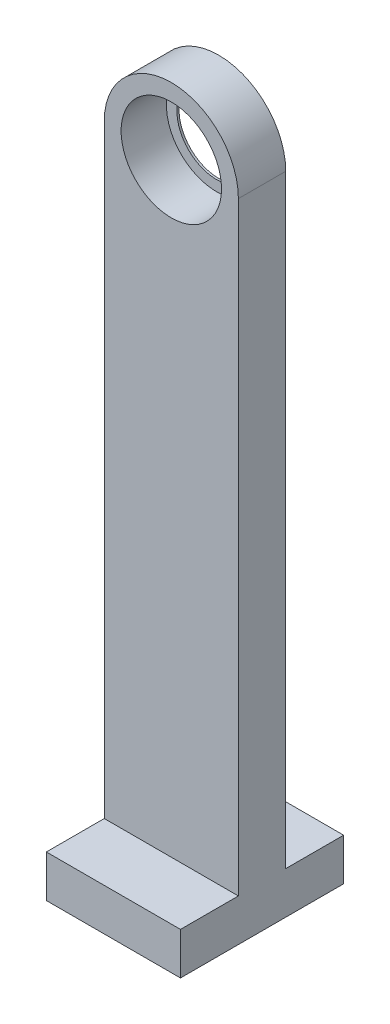
ISO-10303-21;
HEADER;
FILE_DESCRIPTION(('STEP AP214'),'2;1');
FILE_NAME('part.step','',(''),(''),'','','');
FILE_SCHEMA(('AUTOMOTIVE_DESIGN { 1 0 10303 214 1 1 1 1 }'));
ENDSEC;
DATA;
#1=APPLICATION_CONTEXT('core data for automotive mechanical design processes');
#2=APPLICATION_PROTOCOL_DEFINITION('international standard','automotive_design',2000,#1);
#3=PRODUCT_CONTEXT('',#1,'mechanical');
#4=PRODUCT('Part','Part','',(#3));
#5=PRODUCT_RELATED_PRODUCT_CATEGORY('part','',(#4));
#6=PRODUCT_DEFINITION_FORMATION('','',#4);
#7=PRODUCT_DEFINITION_CONTEXT('part definition',#1,'design');
#8=PRODUCT_DEFINITION('design','',#6,#7);
#9=PRODUCT_DEFINITION_SHAPE('','',#8);
#10=(LENGTH_UNIT() NAMED_UNIT(*) SI_UNIT(.MILLI.,.METRE.));
#11=(NAMED_UNIT(*) PLANE_ANGLE_UNIT() SI_UNIT($,.RADIAN.));
#12=(NAMED_UNIT(*) SI_UNIT($,.STERADIAN.) SOLID_ANGLE_UNIT());
#13=UNCERTAINTY_MEASURE_WITH_UNIT(LENGTH_MEASURE(1.E-05),#10,'distance_accuracy_value','');
#14=(GEOMETRIC_REPRESENTATION_CONTEXT(3) GLOBAL_UNCERTAINTY_ASSIGNED_CONTEXT((#13)) GLOBAL_UNIT_ASSIGNED_CONTEXT((#10,
#11,#12)) REPRESENTATION_CONTEXT('',''));
#15=CARTESIAN_POINT('',(0.,0.,0.));
#16=DIRECTION('',(0.,0.,1.));
#17=DIRECTION('',(1.,0.,0.));
#18=AXIS2_PLACEMENT_3D('',#15,#16,#17);
#19=CARTESIAN_POINT('',(0.,0.,4.5));
#20=DIRECTION('',(0.,0.,1.));
#21=DIRECTION('',(1.,0.,0.));
#22=AXIS2_PLACEMENT_3D('',#19,#20,#21);
#23=PLANE('',#22);
#24=DIRECTION('',(-1.,0.,0.));
#25=VECTOR('',#24,1.);
#26=CARTESIAN_POINT('',(0.,-57.37,4.5));
#27=LINE('',#26,#25);
#28=CARTESIAN_POINT('',(6.37005528205707,-57.37,4.5));
#29=VERTEX_POINT('',#28);
#30=CARTESIAN_POINT('',(-6.37005528205707,-57.37,4.5));
#31=VERTEX_POINT('',#30);
#32=EDGE_CURVE('E150',#29,#31,#27,.T.);
#33=ORIENTED_EDGE('',*,*,#32,.F.);
#34=DIRECTION('',(0.,-1.,0.));
#35=VECTOR('',#34,1.);
#36=CARTESIAN_POINT('',(6.37005528205707,0.,4.5));
#37=LINE('',#36,#35);
#38=CARTESIAN_POINT('',(6.37005528205707,0.,4.5));
#39=VERTEX_POINT('',#38);
#40=EDGE_CURVE('E152',#39,#29,#37,.T.);
#41=ORIENTED_EDGE('',*,*,#40,.F.);
#42=CARTESIAN_POINT('',(0.,0.,4.5));
#43=DIRECTION('',(0.,0.,1.));
#44=DIRECTION('',(1.,0.,0.));
#45=AXIS2_PLACEMENT_3D('',#42,#43,#44);
#46=CIRCLE('',#45,6.37005528205707);
#47=CARTESIAN_POINT('',(-6.37005528205707,0.,4.5));
#48=VERTEX_POINT('',#47);
#49=EDGE_CURVE('E42',#39,#48,#46,.T.);
#50=ORIENTED_EDGE('',*,*,#49,.T.);
#51=DIRECTION('',(0.,1.,0.));
#52=VECTOR('',#51,1.);
#53=CARTESIAN_POINT('',(-6.37005528205707,0.,4.5));
#54=LINE('',#53,#52);
#55=EDGE_CURVE('E108',#31,#48,#54,.T.);
#56=ORIENTED_EDGE('',*,*,#55,.F.);
#57=EDGE_LOOP('',(#33,#41,#50,#56));
#58=FACE_BOUND('',#57,.T.);
#59=CARTESIAN_POINT('',(0.,0.,4.5));
#60=DIRECTION('',(0.,0.,1.));
#61=DIRECTION('',(1.,0.,0.));
#62=AXIS2_PLACEMENT_3D('',#59,#60,#61);
#63=CIRCLE('',#62,4.77);
#64=CARTESIAN_POINT('',(4.77,0.,4.5));
#65=VERTEX_POINT('',#64);
#66=EDGE_CURVE('E165',#65,#65,#63,.T.);
#67=ORIENTED_EDGE('',*,*,#66,.F.);
#68=EDGE_LOOP('',(#67));
#69=FACE_BOUND('',#68,.T.);
#70=ADVANCED_FACE('F34',(#58,#69),#23,.T.);
#71=CARTESIAN_POINT('',(0.,0.,0.));
#72=DIRECTION('',(0.,0.,1.));
#73=DIRECTION('',(1.,0.,0.));
#74=AXIS2_PLACEMENT_3D('',#71,#72,#73);
#75=PLANE('',#74);
#76=DIRECTION('',(0.,-1.,0.));
#77=VECTOR('',#76,1.);
#78=CARTESIAN_POINT('',(6.37005528205707,0.,0.));
#79=LINE('',#78,#77);
#80=CARTESIAN_POINT('',(6.37005528205707,0.,0.));
#81=VERTEX_POINT('',#80);
#82=CARTESIAN_POINT('',(6.37005528205708,-57.37,0.));
#83=VERTEX_POINT('',#82);
#84=EDGE_CURVE('E49',#81,#83,#79,.T.);
#85=ORIENTED_EDGE('',*,*,#84,.T.);
#86=DIRECTION('',(-1.,0.,0.));
#87=VECTOR('',#86,1.);
#88=CARTESIAN_POINT('',(0.,-57.37,0.));
#89=LINE('',#88,#87);
#90=CARTESIAN_POINT('',(-6.37005528205707,-57.37,0.));
#91=VERTEX_POINT('',#90);
#92=EDGE_CURVE('E53',#83,#91,#89,.T.);
#93=ORIENTED_EDGE('',*,*,#92,.T.);
#94=DIRECTION('',(0.,1.,0.));
#95=VECTOR('',#94,1.);
#96=CARTESIAN_POINT('',(-6.37005528205707,0.,0.));
#97=LINE('',#96,#95);
#98=CARTESIAN_POINT('',(-6.37005528205707,0.,0.));
#99=VERTEX_POINT('',#98);
#100=EDGE_CURVE('E154',#91,#99,#97,.T.);
#101=ORIENTED_EDGE('',*,*,#100,.T.);
#102=CARTESIAN_POINT('',(0.,0.,0.));
#103=DIRECTION('',(0.,0.,1.));
#104=DIRECTION('',(1.,0.,0.));
#105=AXIS2_PLACEMENT_3D('',#102,#103,#104);
#106=CIRCLE('',#105,6.37005528205707);
#107=EDGE_CURVE('E168',#81,#99,#106,.T.);
#108=ORIENTED_EDGE('',*,*,#107,.F.);
#109=EDGE_LOOP('',(#85,#93,#101,#108));
#110=FACE_BOUND('',#109,.T.);
#111=CARTESIAN_POINT('',(0.,0.,0.));
#112=DIRECTION('',(0.,0.,1.));
#113=DIRECTION('',(1.,0.,0.));
#114=AXIS2_PLACEMENT_3D('',#111,#112,#113);
#115=CIRCLE('',#114,3.77);
#116=CARTESIAN_POINT('',(3.77,0.,0.));
#117=VERTEX_POINT('',#116);
#118=EDGE_CURVE('E127',#117,#117,#115,.T.);
#119=ORIENTED_EDGE('',*,*,#118,.T.);
#120=EDGE_LOOP('',(#119));
#121=FACE_BOUND('',#120,.T.);
#122=ADVANCED_FACE('F199',(#110,#121),#75,.F.);
#123=CARTESIAN_POINT('',(0.,0.,4.5));
#124=DIRECTION('',(0.,0.,-1.));
#125=DIRECTION('',(-1.,0.,0.));
#126=AXIS2_PLACEMENT_3D('',#123,#124,#125);
#127=CYLINDRICAL_SURFACE('',#126,6.37005528205707);
#128=ORIENTED_EDGE('',*,*,#49,.F.);
#129=DIRECTION('',(0.,0.,-1.));
#130=VECTOR('',#129,1.);
#131=CARTESIAN_POINT('',(6.37005528205707,0.,4.5));
#132=LINE('',#131,#130);
#133=EDGE_CURVE('E162',#39,#81,#132,.T.);
#134=ORIENTED_EDGE('',*,*,#133,.T.);
#135=ORIENTED_EDGE('',*,*,#107,.T.);
#136=DIRECTION('',(0.,0.,-1.));
#137=VECTOR('',#136,1.);
#138=CARTESIAN_POINT('',(-6.37005528205707,0.,4.5));
#139=LINE('',#138,#137);
#140=EDGE_CURVE('E159',#48,#99,#139,.T.);
#141=ORIENTED_EDGE('',*,*,#140,.F.);
#142=EDGE_LOOP('',(#128,#134,#135,#141));
#143=FACE_BOUND('',#142,.T.);
#144=ADVANCED_FACE('F36',(#143),#127,.T.);
#145=CARTESIAN_POINT('',(0.,0.,4.5));
#146=DIRECTION('',(0.,0.,-1.));
#147=DIRECTION('',(-1.,0.,0.));
#148=AXIS2_PLACEMENT_3D('',#145,#146,#147);
#149=CYLINDRICAL_SURFACE('',#148,4.77);
#150=CARTESIAN_POINT('',(0.,0.,0.2));
#151=DIRECTION('',(0.,0.,1.));
#152=DIRECTION('',(1.,0.,0.));
#153=AXIS2_PLACEMENT_3D('',#150,#151,#152);
#154=CIRCLE('',#153,4.77);
#155=CARTESIAN_POINT('',(4.77,0.,0.2));
#156=VERTEX_POINT('',#155);
#157=EDGE_CURVE('E11',#156,#156,#154,.T.);
#158=ORIENTED_EDGE('',*,*,#157,.F.);
#159=EDGE_LOOP('',(#158));
#160=FACE_BOUND('',#159,.T.);
#161=ORIENTED_EDGE('',*,*,#66,.T.);
#162=EDGE_LOOP('',(#161));
#163=FACE_BOUND('',#162,.T.);
#164=ADVANCED_FACE('F205',(#160,#163),#149,.F.);
#165=CARTESIAN_POINT('',(6.37005528205707,0.,4.5));
#166=DIRECTION('',(1.,0.,0.));
#167=DIRECTION('',(0.,1.,0.));
#168=AXIS2_PLACEMENT_3D('',#165,#166,#167);
#169=PLANE('',#168);
#170=ORIENTED_EDGE('',*,*,#40,.T.);
#171=DIRECTION('',(0.,0.,1.));
#172=VECTOR('',#171,1.);
#173=CARTESIAN_POINT('',(6.37005528205707,-57.37,-5.5));
#174=LINE('',#173,#172);
#175=CARTESIAN_POINT('',(6.37005528205707,-57.37,10.));
#176=VERTEX_POINT('',#175);
#177=EDGE_CURVE('E114',#29,#176,#174,.T.);
#178=ORIENTED_EDGE('',*,*,#177,.T.);
#179=DIRECTION('',(0.,1.,0.));
#180=VECTOR('',#179,1.);
#181=CARTESIAN_POINT('',(6.37005528205708,-61.37,10.));
#182=LINE('',#181,#180);
#183=CARTESIAN_POINT('',(6.37005528205708,-61.37,10.));
#184=VERTEX_POINT('',#183);
#185=EDGE_CURVE('E111',#184,#176,#182,.T.);
#186=ORIENTED_EDGE('',*,*,#185,.F.);
#187=DIRECTION('',(0.,0.,-1.));
#188=VECTOR('',#187,1.);
#189=CARTESIAN_POINT('',(6.37005528205708,-61.37,4.5));
#190=LINE('',#189,#188);
#191=CARTESIAN_POINT('',(6.37005528205708,-61.37,-5.5));
#192=VERTEX_POINT('',#191);
#193=EDGE_CURVE('E97',#184,#192,#190,.T.);
#194=ORIENTED_EDGE('',*,*,#193,.T.);
#195=DIRECTION('',(0.,1.,0.));
#196=VECTOR('',#195,1.);
#197=CARTESIAN_POINT('',(6.37005528205708,-61.37,-5.5));
#198=LINE('',#197,#196);
#199=CARTESIAN_POINT('',(6.37005528205707,-57.37,-5.5));
#200=VERTEX_POINT('',#199);
#201=EDGE_CURVE('E134',#192,#200,#198,.T.);
#202=ORIENTED_EDGE('',*,*,#201,.T.);
#203=EDGE_CURVE('E146',#200,#83,#174,.T.);
#204=ORIENTED_EDGE('',*,*,#203,.T.);
#205=ORIENTED_EDGE('',*,*,#84,.F.);
#206=ORIENTED_EDGE('',*,*,#133,.F.);
#207=EDGE_LOOP('',(#170,#178,#186,#194,#202,#204,#205,#206));
#208=FACE_BOUND('',#207,.T.);
#209=ADVANCED_FACE('F113',(#208),#169,.T.);
#210=CARTESIAN_POINT('',(-6.37005528205707,0.,4.5));
#211=DIRECTION('',(-1.,0.,0.));
#212=DIRECTION('',(0.,0.,1.));
#213=AXIS2_PLACEMENT_3D('',#210,#211,#212);
#214=PLANE('',#213);
#215=ORIENTED_EDGE('',*,*,#100,.F.);
#216=DIRECTION('',(0.,0.,1.));
#217=VECTOR('',#216,1.);
#218=CARTESIAN_POINT('',(-6.37005528205707,-57.37,-5.5));
#219=LINE('',#218,#217);
#220=CARTESIAN_POINT('',(-6.37005528205707,-57.37,-5.5));
#221=VERTEX_POINT('',#220);
#222=EDGE_CURVE('E142',#221,#91,#219,.T.);
#223=ORIENTED_EDGE('',*,*,#222,.F.);
#224=DIRECTION('',(0.,-1.,0.));
#225=VECTOR('',#224,1.);
#226=CARTESIAN_POINT('',(-6.37005528205707,-57.37,-5.5));
#227=LINE('',#226,#225);
#228=CARTESIAN_POINT('',(-6.37005528205707,-61.37,-5.5));
#229=VERTEX_POINT('',#228);
#230=EDGE_CURVE('E139',#221,#229,#227,.T.);
#231=ORIENTED_EDGE('',*,*,#230,.T.);
#232=DIRECTION('',(0.,0.,-1.));
#233=VECTOR('',#232,1.);
#234=CARTESIAN_POINT('',(-6.37005528205707,-61.37,4.5));
#235=LINE('',#234,#233);
#236=CARTESIAN_POINT('',(-6.37005528205707,-61.37,10.));
#237=VERTEX_POINT('',#236);
#238=EDGE_CURVE('E107',#237,#229,#235,.T.);
#239=ORIENTED_EDGE('',*,*,#238,.F.);
#240=DIRECTION('',(0.,-1.,0.));
#241=VECTOR('',#240,1.);
#242=CARTESIAN_POINT('',(-6.37005528205707,-57.37,10.));
#243=LINE('',#242,#241);
#244=CARTESIAN_POINT('',(-6.37005528205707,-57.37,10.));
#245=VERTEX_POINT('',#244);
#246=EDGE_CURVE('E123',#245,#237,#243,.T.);
#247=ORIENTED_EDGE('',*,*,#246,.F.);
#248=EDGE_CURVE('E145',#31,#245,#219,.T.);
#249=ORIENTED_EDGE('',*,*,#248,.F.);
#250=ORIENTED_EDGE('',*,*,#55,.T.);
#251=ORIENTED_EDGE('',*,*,#140,.T.);
#252=EDGE_LOOP('',(#215,#223,#231,#239,#247,#249,#250,#251));
#253=FACE_BOUND('',#252,.T.);
#254=ADVANCED_FACE('F175',(#253),#214,.T.);
#255=CARTESIAN_POINT('',(0.,-61.37,4.5));
#256=DIRECTION('',(0.,-1.,0.));
#257=DIRECTION('',(0.,0.,-1.));
#258=AXIS2_PLACEMENT_3D('',#255,#256,#257);
#259=PLANE('',#258);
#260=ORIENTED_EDGE('',*,*,#238,.T.);
#261=DIRECTION('',(1.,0.,0.));
#262=VECTOR('',#261,1.);
#263=CARTESIAN_POINT('',(-6.37005528205707,-61.37,-5.5));
#264=LINE('',#263,#262);
#265=EDGE_CURVE('E103',#229,#192,#264,.T.);
#266=ORIENTED_EDGE('',*,*,#265,.T.);
#267=ORIENTED_EDGE('',*,*,#193,.F.);
#268=DIRECTION('',(1.,0.,0.));
#269=VECTOR('',#268,1.);
#270=CARTESIAN_POINT('',(-6.37005528205707,-61.37,10.));
#271=LINE('',#270,#269);
#272=EDGE_CURVE('E101',#237,#184,#271,.T.);
#273=ORIENTED_EDGE('',*,*,#272,.F.);
#274=EDGE_LOOP('',(#260,#266,#267,#273));
#275=FACE_BOUND('',#274,.T.);
#276=ADVANCED_FACE('F99',(#275),#259,.T.);
#277=CARTESIAN_POINT('',(0.,0.,-5.5));
#278=DIRECTION('',(0.,0.,1.));
#279=DIRECTION('',(1.,0.,0.));
#280=AXIS2_PLACEMENT_3D('',#277,#278,#279);
#281=PLANE('',#280);
#282=ORIENTED_EDGE('',*,*,#265,.F.);
#283=ORIENTED_EDGE('',*,*,#230,.F.);
#284=DIRECTION('',(-1.,0.,0.));
#285=VECTOR('',#284,1.);
#286=CARTESIAN_POINT('',(6.37005528205707,-57.37,-5.5));
#287=LINE('',#286,#285);
#288=EDGE_CURVE('E136',#200,#221,#287,.T.);
#289=ORIENTED_EDGE('',*,*,#288,.F.);
#290=ORIENTED_EDGE('',*,*,#201,.F.);
#291=EDGE_LOOP('',(#282,#283,#289,#290));
#292=FACE_BOUND('',#291,.T.);
#293=ADVANCED_FACE('F187',(#292),#281,.F.);
#294=CARTESIAN_POINT('',(6.37005528205707,-57.37,-5.5));
#295=DIRECTION('',(0.,1.,0.));
#296=DIRECTION('',(0.,0.,1.));
#297=AXIS2_PLACEMENT_3D('',#294,#295,#296);
#298=PLANE('',#297);
#299=ORIENTED_EDGE('',*,*,#92,.F.);
#300=ORIENTED_EDGE('',*,*,#203,.F.);
#301=ORIENTED_EDGE('',*,*,#288,.T.);
#302=ORIENTED_EDGE('',*,*,#222,.T.);
#303=EDGE_LOOP('',(#299,#300,#301,#302));
#304=FACE_BOUND('',#303,.T.);
#305=ADVANCED_FACE('F184',(#304),#298,.T.);
#306=ORIENTED_EDGE('',*,*,#177,.F.);
#307=ORIENTED_EDGE('',*,*,#32,.T.);
#308=ORIENTED_EDGE('',*,*,#248,.T.);
#309=DIRECTION('',(-1.,0.,0.));
#310=VECTOR('',#309,1.);
#311=CARTESIAN_POINT('',(6.37005528205707,-57.37,10.));
#312=LINE('',#311,#310);
#313=EDGE_CURVE('E118',#176,#245,#312,.T.);
#314=ORIENTED_EDGE('',*,*,#313,.F.);
#315=EDGE_LOOP('',(#306,#307,#308,#314));
#316=FACE_BOUND('',#315,.T.);
#317=ADVANCED_FACE('F194',(#316),#298,.T.);
#318=CARTESIAN_POINT('',(0.,0.,10.));
#319=DIRECTION('',(0.,0.,1.));
#320=DIRECTION('',(1.,0.,0.));
#321=AXIS2_PLACEMENT_3D('',#318,#319,#320);
#322=PLANE('',#321);
#323=ORIENTED_EDGE('',*,*,#272,.T.);
#324=ORIENTED_EDGE('',*,*,#185,.T.);
#325=ORIENTED_EDGE('',*,*,#313,.T.);
#326=ORIENTED_EDGE('',*,*,#246,.T.);
#327=EDGE_LOOP('',(#323,#324,#325,#326));
#328=FACE_BOUND('',#327,.T.);
#329=ADVANCED_FACE('F121',(#328),#322,.T.);
#330=CARTESIAN_POINT('',(0.,0.,0.2));
#331=DIRECTION('',(0.,0.,1.));
#332=DIRECTION('',(1.,0.,0.));
#333=AXIS2_PLACEMENT_3D('',#330,#331,#332);
#334=PLANE('',#333);
#335=ORIENTED_EDGE('',*,*,#157,.T.);
#336=EDGE_LOOP('',(#335));
#337=FACE_BOUND('',#336,.T.);
#338=CARTESIAN_POINT('',(0.,0.,0.2));
#339=DIRECTION('',(0.,0.,1.));
#340=DIRECTION('',(1.,0.,0.));
#341=AXIS2_PLACEMENT_3D('',#338,#339,#340);
#342=CIRCLE('',#341,3.77);
#343=CARTESIAN_POINT('',(3.77,0.,0.2));
#344=VERTEX_POINT('',#343);
#345=EDGE_CURVE('E124',#344,#344,#342,.T.);
#346=ORIENTED_EDGE('',*,*,#345,.F.);
#347=EDGE_LOOP('',(#346));
#348=FACE_BOUND('',#347,.T.);
#349=ADVANCED_FACE('F217',(#337,#348),#334,.T.);
#350=CARTESIAN_POINT('',(0.,0.,0.2));
#351=DIRECTION('',(0.,0.,-1.));
#352=DIRECTION('',(-1.,0.,0.));
#353=AXIS2_PLACEMENT_3D('',#350,#351,#352);
#354=CYLINDRICAL_SURFACE('',#353,3.77);
#355=ORIENTED_EDGE('',*,*,#345,.T.);
#356=EDGE_LOOP('',(#355));
#357=FACE_BOUND('',#356,.T.);
#358=ORIENTED_EDGE('',*,*,#118,.F.);
#359=EDGE_LOOP('',(#358));
#360=FACE_BOUND('',#359,.T.);
#361=ADVANCED_FACE('F221',(#357,#360),#354,.F.);
#362=CLOSED_SHELL('',(#70,#122,#144,#164,#209,#254,#276,#293,#305,#317,#329,#349,#361));
#363=MANIFOLD_SOLID_BREP('B2',#362);
#364=ADVANCED_BREP_SHAPE_REPRESENTATION('',(#18,#363),#14);
#365=SHAPE_DEFINITION_REPRESENTATION(#9,#364);
ENDSEC;
END-ISO-10303-21;
